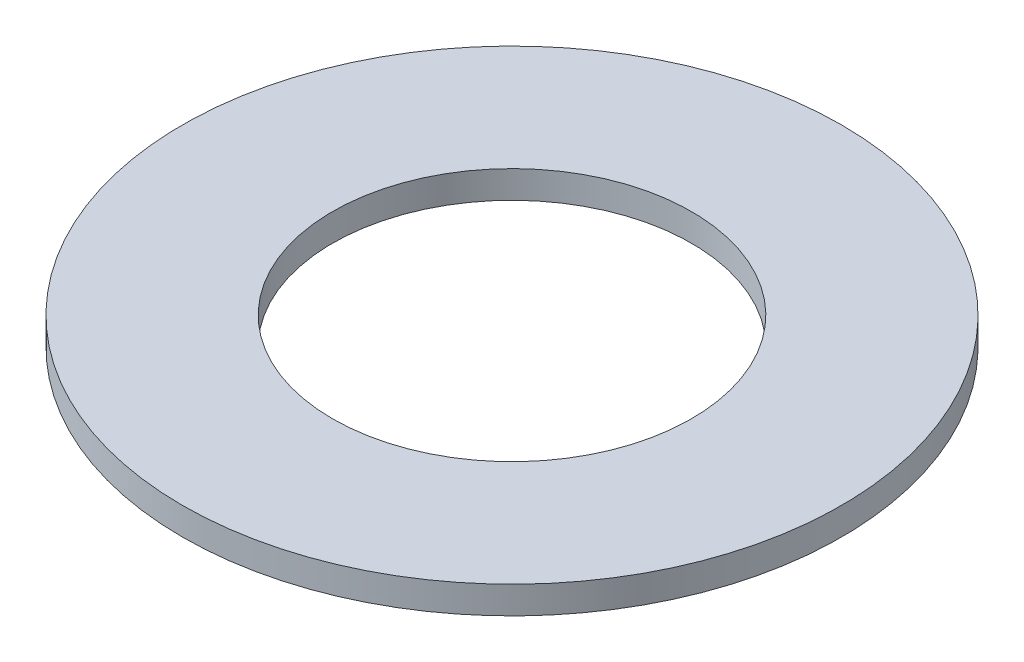
ISO-10303-21;
HEADER;
FILE_DESCRIPTION(('STEP AP214'),'2;1');
FILE_NAME('part.step','',(''),(''),'','','');
FILE_SCHEMA(('AUTOMOTIVE_DESIGN { 1 0 10303 214 1 1 1 1 }'));
ENDSEC;
DATA;
#1=APPLICATION_CONTEXT('core data for automotive mechanical design processes');
#2=APPLICATION_PROTOCOL_DEFINITION('international standard','automotive_design',2000,#1);
#3=PRODUCT_CONTEXT('',#1,'mechanical');
#4=PRODUCT('Part','Part','',(#3));
#5=PRODUCT_RELATED_PRODUCT_CATEGORY('part','',(#4));
#6=PRODUCT_DEFINITION_FORMATION('','',#4);
#7=PRODUCT_DEFINITION_CONTEXT('part definition',#1,'design');
#8=PRODUCT_DEFINITION('design','',#6,#7);
#9=PRODUCT_DEFINITION_SHAPE('','',#8);
#10=(LENGTH_UNIT() NAMED_UNIT(*) SI_UNIT(.MILLI.,.METRE.));
#11=(NAMED_UNIT(*) PLANE_ANGLE_UNIT() SI_UNIT($,.RADIAN.));
#12=(NAMED_UNIT(*) SI_UNIT($,.STERADIAN.) SOLID_ANGLE_UNIT());
#13=UNCERTAINTY_MEASURE_WITH_UNIT(LENGTH_MEASURE(1.E-05),#10,'distance_accuracy_value','');
#14=(GEOMETRIC_REPRESENTATION_CONTEXT(3) GLOBAL_UNCERTAINTY_ASSIGNED_CONTEXT((#13)) GLOBAL_UNIT_ASSIGNED_CONTEXT((#10,
#11,#12)) REPRESENTATION_CONTEXT('',''));
#15=CARTESIAN_POINT('',(0.,0.,0.));
#16=DIRECTION('',(0.,0.,1.));
#17=DIRECTION('',(1.,0.,0.));
#18=AXIS2_PLACEMENT_3D('',#15,#16,#17);
#19=CARTESIAN_POINT('',(0.,3.175,0.));
#20=DIRECTION('',(0.,1.,0.));
#21=DIRECTION('',(0.,0.,1.));
#22=AXIS2_PLACEMENT_3D('',#19,#20,#21);
#23=PLANE('',#22);
#24=CARTESIAN_POINT('',(0.,3.175,0.));
#25=DIRECTION('',(0.,1.,0.));
#26=DIRECTION('',(0.,0.,1.));
#27=AXIS2_PLACEMENT_3D('',#24,#25,#26);
#28=CIRCLE('',#27,38.1);
#29=CARTESIAN_POINT('',(0.,3.175,38.1));
#30=VERTEX_POINT('',#29);
#31=EDGE_CURVE('E10',#30,#30,#28,.T.);
#32=ORIENTED_EDGE('',*,*,#31,.T.);
#33=EDGE_LOOP('',(#32));
#34=FACE_BOUND('',#33,.T.);
#35=CARTESIAN_POINT('',(0.,3.175,0.));
#36=DIRECTION('',(0.,1.,0.));
#37=DIRECTION('',(0.,0.,1.));
#38=AXIS2_PLACEMENT_3D('',#35,#36,#37);
#39=CIRCLE('',#38,20.7518);
#40=CARTESIAN_POINT('',(0.,3.175,20.7518));
#41=VERTEX_POINT('',#40);
#42=EDGE_CURVE('E46',#41,#41,#39,.T.);
#43=ORIENTED_EDGE('',*,*,#42,.F.);
#44=EDGE_LOOP('',(#43));
#45=FACE_BOUND('',#44,.T.);
#46=ADVANCED_FACE('F35',(#34,#45),#23,.T.);
#47=CARTESIAN_POINT('',(0.,0.,0.));
#48=DIRECTION('',(0.,1.,0.));
#49=DIRECTION('',(0.,0.,1.));
#50=AXIS2_PLACEMENT_3D('',#47,#48,#49);
#51=PLANE('',#50);
#52=CARTESIAN_POINT('',(0.,0.,0.));
#53=DIRECTION('',(0.,1.,0.));
#54=DIRECTION('',(0.,0.,1.));
#55=AXIS2_PLACEMENT_3D('',#52,#53,#54);
#56=CIRCLE('',#55,38.1);
#57=CARTESIAN_POINT('',(0.,0.,38.1));
#58=VERTEX_POINT('',#57);
#59=EDGE_CURVE('E39',#58,#58,#56,.T.);
#60=ORIENTED_EDGE('',*,*,#59,.F.);
#61=EDGE_LOOP('',(#60));
#62=FACE_BOUND('',#61,.T.);
#63=CARTESIAN_POINT('',(0.,0.,0.));
#64=DIRECTION('',(0.,1.,0.));
#65=DIRECTION('',(0.,0.,1.));
#66=AXIS2_PLACEMENT_3D('',#63,#64,#65);
#67=CIRCLE('',#66,20.7518);
#68=CARTESIAN_POINT('',(0.,0.,20.7518));
#69=VERTEX_POINT('',#68);
#70=EDGE_CURVE('E48',#69,#69,#67,.T.);
#71=ORIENTED_EDGE('',*,*,#70,.T.);
#72=EDGE_LOOP('',(#71));
#73=FACE_BOUND('',#72,.T.);
#74=ADVANCED_FACE('F58',(#62,#73),#51,.F.);
#75=CARTESIAN_POINT('',(0.,3.175,0.));
#76=DIRECTION('',(0.,-1.,0.));
#77=DIRECTION('',(0.,0.,-1.));
#78=AXIS2_PLACEMENT_3D('',#75,#76,#77);
#79=CYLINDRICAL_SURFACE('',#78,38.1);
#80=ORIENTED_EDGE('',*,*,#31,.F.);
#81=EDGE_LOOP('',(#80));
#82=FACE_BOUND('',#81,.T.);
#83=ORIENTED_EDGE('',*,*,#59,.T.);
#84=EDGE_LOOP('',(#83));
#85=FACE_BOUND('',#84,.T.);
#86=ADVANCED_FACE('F37',(#82,#85),#79,.T.);
#87=CARTESIAN_POINT('',(0.,3.175,0.));
#88=DIRECTION('',(0.,-1.,0.));
#89=DIRECTION('',(0.,0.,-1.));
#90=AXIS2_PLACEMENT_3D('',#87,#88,#89);
#91=CYLINDRICAL_SURFACE('',#90,20.7518);
#92=ORIENTED_EDGE('',*,*,#42,.T.);
#93=EDGE_LOOP('',(#92));
#94=FACE_BOUND('',#93,.T.);
#95=ORIENTED_EDGE('',*,*,#70,.F.);
#96=EDGE_LOOP('',(#95));
#97=FACE_BOUND('',#96,.T.);
#98=ADVANCED_FACE('F54',(#94,#97),#91,.F.);
#99=CLOSED_SHELL('',(#46,#74,#86,#98));
#100=MANIFOLD_SOLID_BREP('B2',#99);
#101=ADVANCED_BREP_SHAPE_REPRESENTATION('',(#18,#100),#14);
#102=SHAPE_DEFINITION_REPRESENTATION(#9,#101);
ENDSEC;
END-ISO-10303-21;
